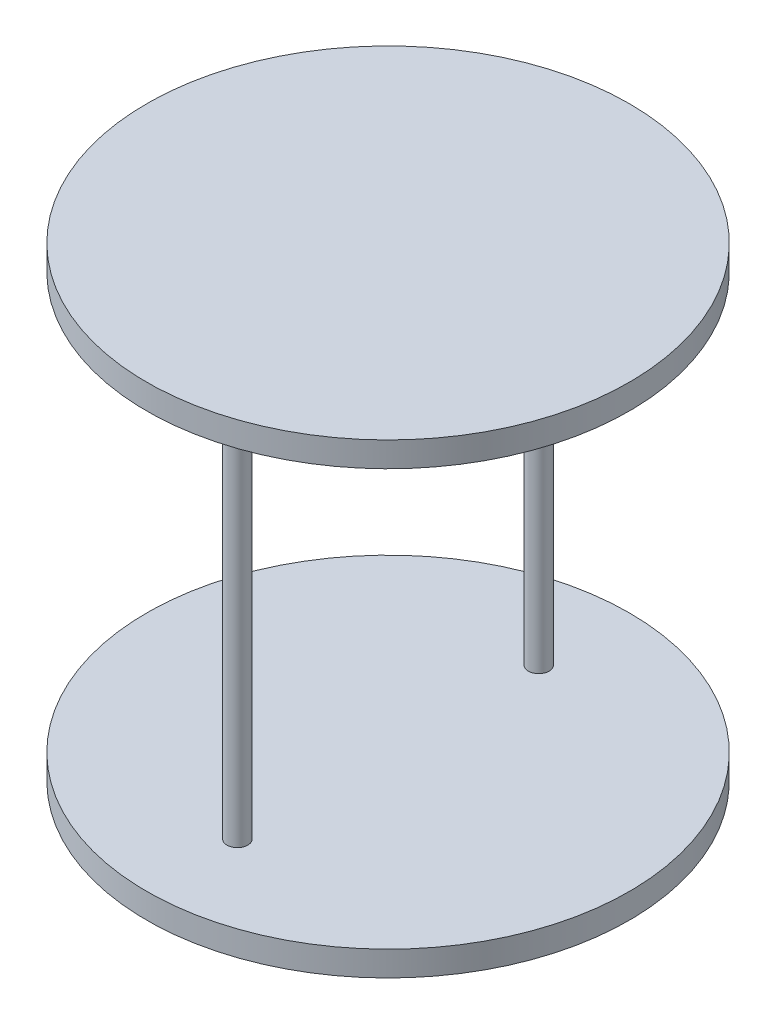
ISO-10303-21;
HEADER;
FILE_DESCRIPTION(('STEP AP214'),'2;1');
FILE_NAME('part.step','',(''),(''),'','','');
FILE_SCHEMA(('AUTOMOTIVE_DESIGN { 1 0 10303 214 1 1 1 1 }'));
ENDSEC;
DATA;
#1=APPLICATION_CONTEXT('core data for automotive mechanical design processes');
#2=APPLICATION_PROTOCOL_DEFINITION('international standard','automotive_design',2000,#1);
#3=PRODUCT_CONTEXT('',#1,'mechanical');
#4=PRODUCT('Part','Part','',(#3));
#5=PRODUCT_RELATED_PRODUCT_CATEGORY('part','',(#4));
#6=PRODUCT_DEFINITION_FORMATION('','',#4);
#7=PRODUCT_DEFINITION_CONTEXT('part definition',#1,'design');
#8=PRODUCT_DEFINITION('design','',#6,#7);
#9=PRODUCT_DEFINITION_SHAPE('','',#8);
#10=(LENGTH_UNIT() NAMED_UNIT(*) SI_UNIT(.MILLI.,.METRE.));
#11=(NAMED_UNIT(*) PLANE_ANGLE_UNIT() SI_UNIT($,.RADIAN.));
#12=(NAMED_UNIT(*) SI_UNIT($,.STERADIAN.) SOLID_ANGLE_UNIT());
#13=UNCERTAINTY_MEASURE_WITH_UNIT(LENGTH_MEASURE(1.E-05),#10,'distance_accuracy_value','');
#14=(GEOMETRIC_REPRESENTATION_CONTEXT(3) GLOBAL_UNCERTAINTY_ASSIGNED_CONTEXT((#13)) GLOBAL_UNIT_ASSIGNED_CONTEXT((#10,
#11,#12)) REPRESENTATION_CONTEXT('',''));
#15=CARTESIAN_POINT('',(0.,0.,0.));
#16=DIRECTION('',(0.,0.,1.));
#17=DIRECTION('',(1.,0.,0.));
#18=AXIS2_PLACEMENT_3D('',#15,#16,#17);
#19=CARTESIAN_POINT('',(0.,7.62,0.));
#20=DIRECTION('',(0.,-1.,0.));
#21=DIRECTION('',(0.,0.,-1.));
#22=AXIS2_PLACEMENT_3D('',#19,#20,#21);
#23=CYLINDRICAL_SURFACE('',#22,73.66);
#24=CARTESIAN_POINT('',(0.,7.62,0.));
#25=DIRECTION('',(0.,1.,0.));
#26=DIRECTION('',(0.,0.,1.));
#27=AXIS2_PLACEMENT_3D('',#24,#25,#26);
#28=CIRCLE('',#27,73.66);
#29=CARTESIAN_POINT('',(0.,7.62,-73.66));
#30=VERTEX_POINT('',#29);
#31=EDGE_CURVE('E10',#30,#30,#28,.T.);
#32=CARTESIAN_POINT('',(0.,0.,0.));
#33=DIRECTION('',(0.,1.,0.));
#34=DIRECTION('',(0.,0.,1.));
#35=AXIS2_PLACEMENT_3D('',#32,#33,#34);
#36=CIRCLE('',#35,73.66);
#37=CARTESIAN_POINT('',(0.,0.,-73.66));
#38=VERTEX_POINT('',#37);
#39=EDGE_CURVE('E38',#38,#38,#36,.T.);
#40=CARTESIAN_POINT('',(0.,7.62,-73.66));
#41=CARTESIAN_POINT('',(0.,7.540625,-73.66));
#42=CARTESIAN_POINT('',(0.,7.46125,-73.66));
#43=CARTESIAN_POINT('',(0.,7.3025,-73.66));
#44=CARTESIAN_POINT('',(0.,7.223125,-73.66));
#45=CARTESIAN_POINT('',(0.,7.064375,-73.66));
#46=CARTESIAN_POINT('',(0.,6.985,-73.66));
#47=CARTESIAN_POINT('',(0.,6.82625,-73.66));
#48=CARTESIAN_POINT('',(0.,6.746875,-73.66));
#49=CARTESIAN_POINT('',(0.,6.588125,-73.66));
#50=CARTESIAN_POINT('',(0.,6.50875,-73.66));
#51=CARTESIAN_POINT('',(0.,6.35,-73.66));
#52=CARTESIAN_POINT('',(0.,6.270625,-73.66));
#53=CARTESIAN_POINT('',(0.,6.111875,-73.66));
#54=CARTESIAN_POINT('',(0.,6.0325,-73.66));
#55=CARTESIAN_POINT('',(0.,5.87375,-73.66));
#56=CARTESIAN_POINT('',(0.,5.794375,-73.66));
#57=CARTESIAN_POINT('',(0.,5.635625,-73.66));
#58=CARTESIAN_POINT('',(0.,5.55625,-73.66));
#59=CARTESIAN_POINT('',(0.,5.3975,-73.66));
#60=CARTESIAN_POINT('',(0.,5.318125,-73.66));
#61=CARTESIAN_POINT('',(0.,5.159375,-73.66));
#62=CARTESIAN_POINT('',(0.,5.08,-73.66));
#63=CARTESIAN_POINT('',(0.,4.92125,-73.66));
#64=CARTESIAN_POINT('',(0.,4.841875,-73.66));
#65=CARTESIAN_POINT('',(0.,4.683125,-73.66));
#66=CARTESIAN_POINT('',(0.,4.60375,-73.66));
#67=CARTESIAN_POINT('',(0.,4.445,-73.66));
#68=CARTESIAN_POINT('',(0.,4.365625,-73.66));
#69=CARTESIAN_POINT('',(0.,4.206875,-73.66));
#70=CARTESIAN_POINT('',(0.,4.1275,-73.66));
#71=CARTESIAN_POINT('',(0.,3.96875,-73.66));
#72=CARTESIAN_POINT('',(0.,3.889375,-73.66));
#73=CARTESIAN_POINT('',(0.,3.730625,-73.66));
#74=CARTESIAN_POINT('',(0.,3.65125,-73.66));
#75=CARTESIAN_POINT('',(0.,3.4925,-73.66));
#76=CARTESIAN_POINT('',(0.,3.413125,-73.66));
#77=CARTESIAN_POINT('',(0.,3.254375,-73.66));
#78=CARTESIAN_POINT('',(0.,3.175,-73.66));
#79=CARTESIAN_POINT('',(0.,3.01625,-73.66));
#80=CARTESIAN_POINT('',(0.,2.936875,-73.66));
#81=CARTESIAN_POINT('',(0.,2.778125,-73.66));
#82=CARTESIAN_POINT('',(0.,2.69875,-73.66));
#83=CARTESIAN_POINT('',(0.,2.54,-73.66));
#84=CARTESIAN_POINT('',(0.,2.460625,-73.66));
#85=CARTESIAN_POINT('',(0.,2.301875,-73.66));
#86=CARTESIAN_POINT('',(0.,2.2225,-73.66));
#87=CARTESIAN_POINT('',(0.,2.06375,-73.66));
#88=CARTESIAN_POINT('',(0.,1.984375,-73.66));
#89=CARTESIAN_POINT('',(0.,1.825625,-73.66));
#90=CARTESIAN_POINT('',(0.,1.74625,-73.66));
#91=CARTESIAN_POINT('',(0.,1.5875,-73.66));
#92=CARTESIAN_POINT('',(0.,1.508125,-73.66));
#93=CARTESIAN_POINT('',(0.,1.349375,-73.66));
#94=CARTESIAN_POINT('',(0.,1.27,-73.66));
#95=CARTESIAN_POINT('',(0.,1.11125,-73.66));
#96=CARTESIAN_POINT('',(0.,1.031875,-73.66));
#97=CARTESIAN_POINT('',(0.,0.873125,-73.66));
#98=CARTESIAN_POINT('',(0.,0.79375,-73.66));
#99=CARTESIAN_POINT('',(0.,0.635,-73.66));
#100=CARTESIAN_POINT('',(0.,0.555625,-73.66));
#101=CARTESIAN_POINT('',(0.,0.396875,-73.66));
#102=CARTESIAN_POINT('',(0.,0.3175,-73.66));
#103=CARTESIAN_POINT('',(0.,0.15875,-73.66));
#104=CARTESIAN_POINT('',(0.,0.0793749999999999,-73.66));
#105=CARTESIAN_POINT('',(0.,0.,-73.66));
#106=B_SPLINE_CURVE_WITH_KNOTS('',3,(#40,#41,#42,#43,#44,#45,#46,#47,#48,#49,#50,#51,#52,#53,
#54,#55,#56,#57,#58,#59,#60,#61,#62,#63,#64,#65,#66,#67,#68,#69,#70,#71,#72,#73,#74,#75,#76,#77,
#78,#79,#80,#81,#82,#83,#84,#85,#86,#87,#88,#89,#90,#91,#92,#93,#94,#95,#96,#97,#98,#99,#100,
#101,#102,#103,#104,#105),.UNSPECIFIED.,.F.,.F.,(4,2,2,2,2,2,2,2,2,2,2,2,2,2,2,2,2,2,2,2,2,2,2,
2,2,2,2,2,2,2,2,2,4),(0.,0.238125,0.476249999999999,0.714375,0.952499999999999,1.190625,1.42875,
1.666875,1.905,2.143125,2.38125,2.619375,2.8575,3.095625,3.33375,3.571875,3.81,4.048125,4.28625,
4.524375,4.7625,5.000625,5.23875,5.476875,5.715,5.953125,6.19125,6.429375,6.6675,6.905625,
7.14375,7.381875,7.62),.UNSPECIFIED.);
#107=EDGE_CURVE('BSEAM35',#30,#38,#106,.T.);
#108=ORIENTED_EDGE('',*,*,#31,.F.);
#109=ORIENTED_EDGE('',*,*,#39,.T.);
#110=ORIENTED_EDGE('',*,*,#107,.T.);
#111=ORIENTED_EDGE('',*,*,#107,.F.);
#112=EDGE_LOOP('',(#108,#110,#109,#111));
#113=FACE_BOUND('',#112,.T.);
#114=ADVANCED_FACE('F35',(#113),#23,.T.);
#115=CARTESIAN_POINT('',(0.,7.62,0.));
#116=DIRECTION('',(0.,1.,0.));
#117=DIRECTION('',(0.,0.,1.));
#118=AXIS2_PLACEMENT_3D('',#115,#116,#117);
#119=PLANE('',#118);
#120=CARTESIAN_POINT('',(0.,7.62,46.));
#121=DIRECTION('',(0.,1.,0.));
#122=DIRECTION('',(0.,0.,1.));
#123=AXIS2_PLACEMENT_3D('',#120,#121,#122);
#124=CIRCLE('',#123,3.175);
#125=CARTESIAN_POINT('',(0.,7.62,49.175));
#126=VERTEX_POINT('',#125);
#127=EDGE_CURVE('E49',#126,#126,#124,.T.);
#128=ORIENTED_EDGE('',*,*,#127,.F.);
#129=EDGE_LOOP('',(#128));
#130=FACE_BOUND('',#129,.T.);
#131=CARTESIAN_POINT('',(0.,7.62,-46.));
#132=DIRECTION('',(0.,1.,0.));
#133=DIRECTION('',(0.,0.,1.));
#134=AXIS2_PLACEMENT_3D('',#131,#132,#133);
#135=CIRCLE('',#134,3.175);
#136=CARTESIAN_POINT('',(0.,7.62,-42.825));
#137=VERTEX_POINT('',#136);
#138=EDGE_CURVE('E45',#137,#137,#135,.T.);
#139=ORIENTED_EDGE('',*,*,#138,.F.);
#140=EDGE_LOOP('',(#139));
#141=FACE_BOUND('',#140,.T.);
#142=ORIENTED_EDGE('',*,*,#31,.T.);
#143=EDGE_LOOP('',(#142));
#144=FACE_BOUND('',#143,.T.);
#145=ADVANCED_FACE('F84',(#130,#141,#144),#119,.T.);
#146=CARTESIAN_POINT('',(0.,0.,0.));
#147=DIRECTION('',(0.,1.,0.));
#148=DIRECTION('',(0.,0.,1.));
#149=AXIS2_PLACEMENT_3D('',#146,#147,#148);
#150=PLANE('',#149);
#151=ORIENTED_EDGE('',*,*,#39,.F.);
#152=EDGE_LOOP('',(#151));
#153=FACE_BOUND('',#152,.T.);
#154=ADVANCED_FACE('F89',(#153),#150,.F.);
#155=CARTESIAN_POINT('',(0.,71.12,-46.));
#156=DIRECTION('',(0.,-1.,0.));
#157=DIRECTION('',(0.,0.,-1.));
#158=AXIS2_PLACEMENT_3D('',#155,#156,#157);
#159=CYLINDRICAL_SURFACE('',#158,3.175);
#160=ORIENTED_EDGE('',*,*,#138,.T.);
#161=EDGE_LOOP('',(#160));
#162=FACE_BOUND('',#161,.T.);
#163=CARTESIAN_POINT('',(0.,134.62,-46.));
#164=DIRECTION('',(0.,1.,0.));
#165=DIRECTION('',(0.,0.,1.));
#166=AXIS2_PLACEMENT_3D('',#163,#164,#165);
#167=CIRCLE('',#166,3.175);
#168=CARTESIAN_POINT('',(0.,134.62,-42.825));
#169=VERTEX_POINT('',#168);
#170=EDGE_CURVE('E52',#169,#169,#167,.T.);
#171=ORIENTED_EDGE('',*,*,#170,.F.);
#172=EDGE_LOOP('',(#171));
#173=FACE_BOUND('',#172,.T.);
#174=ADVANCED_FACE('F96',(#162,#173),#159,.T.);
#175=CARTESIAN_POINT('',(0.,71.12,46.));
#176=DIRECTION('',(0.,-1.,0.));
#177=DIRECTION('',(0.,0.,-1.));
#178=AXIS2_PLACEMENT_3D('',#175,#176,#177);
#179=CYLINDRICAL_SURFACE('',#178,3.175);
#180=ORIENTED_EDGE('',*,*,#127,.T.);
#181=EDGE_LOOP('',(#180));
#182=FACE_BOUND('',#181,.T.);
#183=CARTESIAN_POINT('',(0.,134.62,46.));
#184=DIRECTION('',(0.,1.,0.));
#185=DIRECTION('',(0.,0.,1.));
#186=AXIS2_PLACEMENT_3D('',#183,#184,#185);
#187=CIRCLE('',#186,3.175);
#188=CARTESIAN_POINT('',(0.,134.62,49.175));
#189=VERTEX_POINT('',#188);
#190=EDGE_CURVE('E55',#189,#189,#187,.T.);
#191=ORIENTED_EDGE('',*,*,#190,.F.);
#192=EDGE_LOOP('',(#191));
#193=FACE_BOUND('',#192,.T.);
#194=ADVANCED_FACE('F70',(#182,#193),#179,.T.);
#195=CARTESIAN_POINT('',(0.,142.24,0.));
#196=DIRECTION('',(0.,-1.,0.));
#197=DIRECTION('',(0.,0.,-1.));
#198=AXIS2_PLACEMENT_3D('',#195,#196,#197);
#199=CYLINDRICAL_SURFACE('',#198,73.66);
#200=CARTESIAN_POINT('',(0.,142.24,0.));
#201=DIRECTION('',(0.,1.,0.));
#202=DIRECTION('',(0.,0.,1.));
#203=AXIS2_PLACEMENT_3D('',#200,#201,#202);
#204=CIRCLE('',#203,73.66);
#205=CARTESIAN_POINT('',(0.,142.24,-73.66));
#206=VERTEX_POINT('',#205);
#207=EDGE_CURVE('E58',#206,#206,#204,.T.);
#208=CARTESIAN_POINT('',(0.,134.62,0.));
#209=DIRECTION('',(0.,1.,0.));
#210=DIRECTION('',(0.,0.,1.));
#211=AXIS2_PLACEMENT_3D('',#208,#209,#210);
#212=CIRCLE('',#211,73.66);
#213=CARTESIAN_POINT('',(0.,134.62,-73.66));
#214=VERTEX_POINT('',#213);
#215=EDGE_CURVE('E59',#214,#214,#212,.T.);
#216=CARTESIAN_POINT('',(0.,142.24,-73.66));
#217=CARTESIAN_POINT('',(0.,142.160625,-73.66));
#218=CARTESIAN_POINT('',(0.,142.08125,-73.66));
#219=CARTESIAN_POINT('',(0.,141.9225,-73.66));
#220=CARTESIAN_POINT('',(0.,141.843125,-73.66));
#221=CARTESIAN_POINT('',(0.,141.684375,-73.66));
#222=CARTESIAN_POINT('',(0.,141.605,-73.66));
#223=CARTESIAN_POINT('',(0.,141.44625,-73.66));
#224=CARTESIAN_POINT('',(0.,141.366875,-73.66));
#225=CARTESIAN_POINT('',(0.,141.208125,-73.66));
#226=CARTESIAN_POINT('',(0.,141.12875,-73.66));
#227=CARTESIAN_POINT('',(0.,140.97,-73.66));
#228=CARTESIAN_POINT('',(0.,140.890625,-73.66));
#229=CARTESIAN_POINT('',(0.,140.731875,-73.66));
#230=CARTESIAN_POINT('',(0.,140.6525,-73.66));
#231=CARTESIAN_POINT('',(0.,140.49375,-73.66));
#232=CARTESIAN_POINT('',(0.,140.414375,-73.66));
#233=CARTESIAN_POINT('',(0.,140.255625,-73.66));
#234=CARTESIAN_POINT('',(0.,140.17625,-73.66));
#235=CARTESIAN_POINT('',(0.,140.0175,-73.66));
#236=CARTESIAN_POINT('',(0.,139.938125,-73.66));
#237=CARTESIAN_POINT('',(0.,139.779375,-73.66));
#238=CARTESIAN_POINT('',(0.,139.7,-73.66));
#239=CARTESIAN_POINT('',(0.,139.54125,-73.66));
#240=CARTESIAN_POINT('',(0.,139.461875,-73.66));
#241=CARTESIAN_POINT('',(0.,139.303125,-73.66));
#242=CARTESIAN_POINT('',(0.,139.22375,-73.66));
#243=CARTESIAN_POINT('',(0.,139.065,-73.66));
#244=CARTESIAN_POINT('',(0.,138.985625,-73.66));
#245=CARTESIAN_POINT('',(0.,138.826875,-73.66));
#246=CARTESIAN_POINT('',(0.,138.7475,-73.66));
#247=CARTESIAN_POINT('',(0.,138.58875,-73.66));
#248=CARTESIAN_POINT('',(0.,138.509375,-73.66));
#249=CARTESIAN_POINT('',(0.,138.350625,-73.66));
#250=CARTESIAN_POINT('',(0.,138.27125,-73.66));
#251=CARTESIAN_POINT('',(0.,138.1125,-73.66));
#252=CARTESIAN_POINT('',(0.,138.033125,-73.66));
#253=CARTESIAN_POINT('',(0.,137.874375,-73.66));
#254=CARTESIAN_POINT('',(0.,137.795,-73.66));
#255=CARTESIAN_POINT('',(0.,137.63625,-73.66));
#256=CARTESIAN_POINT('',(0.,137.556875,-73.66));
#257=CARTESIAN_POINT('',(0.,137.398125,-73.66));
#258=CARTESIAN_POINT('',(0.,137.31875,-73.66));
#259=CARTESIAN_POINT('',(0.,137.16,-73.66));
#260=CARTESIAN_POINT('',(0.,137.080625,-73.66));
#261=CARTESIAN_POINT('',(0.,136.921875,-73.66));
#262=CARTESIAN_POINT('',(0.,136.8425,-73.66));
#263=CARTESIAN_POINT('',(0.,136.68375,-73.66));
#264=CARTESIAN_POINT('',(0.,136.604375,-73.66));
#265=CARTESIAN_POINT('',(0.,136.445625,-73.66));
#266=CARTESIAN_POINT('',(0.,136.36625,-73.66));
#267=CARTESIAN_POINT('',(0.,136.2075,-73.66));
#268=CARTESIAN_POINT('',(0.,136.128125,-73.66));
#269=CARTESIAN_POINT('',(0.,135.969375,-73.66));
#270=CARTESIAN_POINT('',(0.,135.89,-73.66));
#271=CARTESIAN_POINT('',(0.,135.73125,-73.66));
#272=CARTESIAN_POINT('',(0.,135.651875,-73.66));
#273=CARTESIAN_POINT('',(0.,135.493125,-73.66));
#274=CARTESIAN_POINT('',(0.,135.41375,-73.66));
#275=CARTESIAN_POINT('',(0.,135.255,-73.66));
#276=CARTESIAN_POINT('',(0.,135.175625,-73.66));
#277=CARTESIAN_POINT('',(0.,135.016875,-73.66));
#278=CARTESIAN_POINT('',(0.,134.9375,-73.66));
#279=CARTESIAN_POINT('',(0.,134.77875,-73.66));
#280=CARTESIAN_POINT('',(0.,134.699375,-73.66));
#281=CARTESIAN_POINT('',(0.,134.62,-73.66));
#282=B_SPLINE_CURVE_WITH_KNOTS('',3,(#216,#217,#218,#219,#220,#221,#222,#223,#224,#225,#226,
#227,#228,#229,#230,#231,#232,#233,#234,#235,#236,#237,#238,#239,#240,#241,#242,#243,#244,#245,
#246,#247,#248,#249,#250,#251,#252,#253,#254,#255,#256,#257,#258,#259,#260,#261,#262,#263,#264,
#265,#266,#267,#268,#269,#270,#271,#272,#273,#274,#275,#276,#277,#278,#279,#280,#281),
.UNSPECIFIED.,.F.,.F.,(4,2,2,2,2,2,2,2,2,2,2,2,2,2,2,2,2,2,2,2,2,2,2,2,2,2,2,2,2,2,2,2,4),(0.,
0.238124999999978,0.476249999999984,0.714374999999989,0.952499999999995,1.19062499999997,
1.42874999999998,1.66687499999998,1.90499999999999,2.143125,2.38124999999997,2.61937499999998,
2.85749999999998,3.09562499999999,3.33374999999997,3.57187499999997,3.80999999999998,
4.04812499999999,4.28624999999999,4.52437499999997,4.76249999999998,5.00062499999998,
5.23874999999999,5.47687499999996,5.71499999999997,5.95312499999998,6.19124999999998,
6.42937499999999,6.66749999999996,6.90562499999997,7.14374999999998,7.38187499999998,
7.61999999999999),.UNSPECIFIED.);
#283=EDGE_CURVE('BSEAM67',#206,#214,#282,.T.);
#284=ORIENTED_EDGE('',*,*,#207,.F.);
#285=ORIENTED_EDGE('',*,*,#215,.T.);
#286=ORIENTED_EDGE('',*,*,#283,.T.);
#287=ORIENTED_EDGE('',*,*,#283,.F.);
#288=EDGE_LOOP('',(#284,#286,#285,#287));
#289=FACE_BOUND('',#288,.T.);
#290=ADVANCED_FACE('F67',(#289),#199,.T.);
#291=CARTESIAN_POINT('',(0.,142.24,0.));
#292=DIRECTION('',(0.,1.,0.));
#293=DIRECTION('',(0.,0.,1.));
#294=AXIS2_PLACEMENT_3D('',#291,#292,#293);
#295=PLANE('',#294);
#296=ORIENTED_EDGE('',*,*,#207,.T.);
#297=EDGE_LOOP('',(#296));
#298=FACE_BOUND('',#297,.T.);
#299=ADVANCED_FACE('F65',(#298),#295,.T.);
#300=CARTESIAN_POINT('',(0.,134.62,0.));
#301=DIRECTION('',(0.,1.,0.));
#302=DIRECTION('',(0.,0.,1.));
#303=AXIS2_PLACEMENT_3D('',#300,#301,#302);
#304=PLANE('',#303);
#305=ORIENTED_EDGE('',*,*,#170,.T.);
#306=EDGE_LOOP('',(#305));
#307=FACE_BOUND('',#306,.T.);
#308=ORIENTED_EDGE('',*,*,#190,.T.);
#309=EDGE_LOOP('',(#308));
#310=FACE_BOUND('',#309,.T.);
#311=ORIENTED_EDGE('',*,*,#215,.F.);
#312=EDGE_LOOP('',(#311));
#313=FACE_BOUND('',#312,.T.);
#314=ADVANCED_FACE('F74',(#307,#310,#313),#304,.F.);
#315=CLOSED_SHELL('',(#114,#145,#154,#174,#194,#290,#299,#314));
#316=MANIFOLD_SOLID_BREP('B2',#315);
#317=ADVANCED_BREP_SHAPE_REPRESENTATION('',(#18,#316),#14);
#318=SHAPE_DEFINITION_REPRESENTATION(#9,#317);
ENDSEC;
END-ISO-10303-21;
